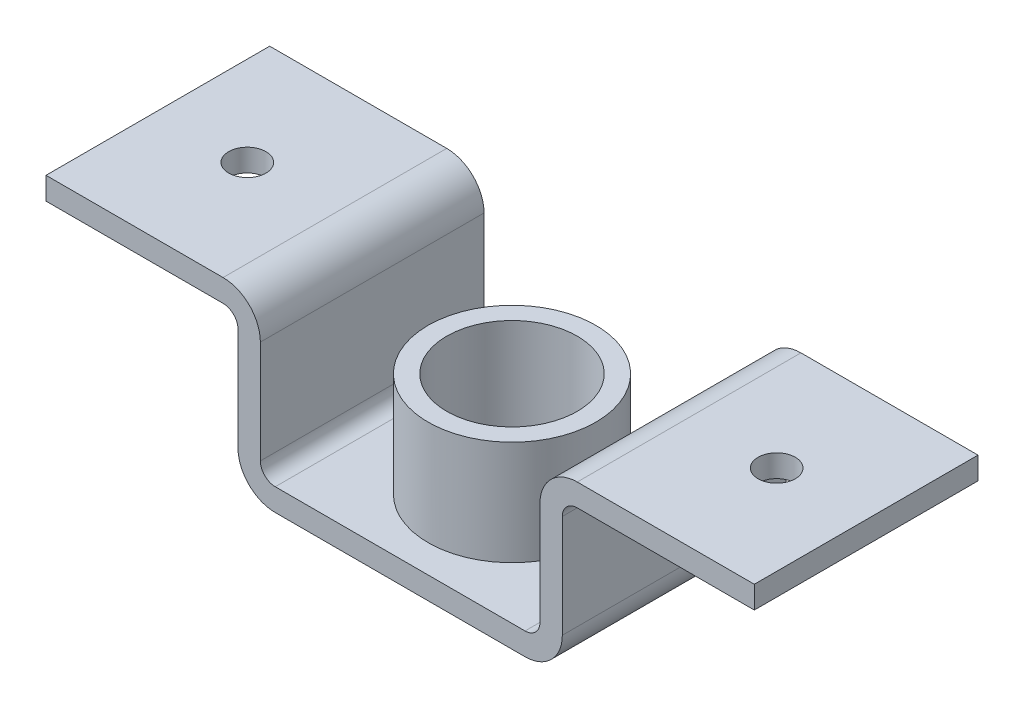
ISO-10303-21;
HEADER;
FILE_DESCRIPTION(('STEP AP214'),'2;1');
FILE_NAME('part.step','',(''),(''),'','','');
FILE_SCHEMA(('AUTOMOTIVE_DESIGN { 1 0 10303 214 1 1 1 1 }'));
ENDSEC;
DATA;
#1=APPLICATION_CONTEXT('core data for automotive mechanical design processes');
#2=APPLICATION_PROTOCOL_DEFINITION('international standard','automotive_design',2000,#1);
#3=PRODUCT_CONTEXT('',#1,'mechanical');
#4=PRODUCT('Part','Part','',(#3));
#5=PRODUCT_RELATED_PRODUCT_CATEGORY('part','',(#4));
#6=PRODUCT_DEFINITION_FORMATION('','',#4);
#7=PRODUCT_DEFINITION_CONTEXT('part definition',#1,'design');
#8=PRODUCT_DEFINITION('design','',#6,#7);
#9=PRODUCT_DEFINITION_SHAPE('','',#8);
#10=(LENGTH_UNIT() NAMED_UNIT(*) SI_UNIT(.MILLI.,.METRE.));
#11=(NAMED_UNIT(*) PLANE_ANGLE_UNIT() SI_UNIT($,.RADIAN.));
#12=(NAMED_UNIT(*) SI_UNIT($,.STERADIAN.) SOLID_ANGLE_UNIT());
#13=UNCERTAINTY_MEASURE_WITH_UNIT(LENGTH_MEASURE(1.E-05),#10,'distance_accuracy_value','');
#14=(GEOMETRIC_REPRESENTATION_CONTEXT(3) GLOBAL_UNCERTAINTY_ASSIGNED_CONTEXT((#13)) GLOBAL_UNIT_ASSIGNED_CONTEXT((#10,
#11,#12)) REPRESENTATION_CONTEXT('',''));
#15=CARTESIAN_POINT('',(0.,0.,0.));
#16=DIRECTION('',(0.,0.,1.));
#17=DIRECTION('',(1.,0.,0.));
#18=AXIS2_PLACEMENT_3D('',#15,#16,#17);
#19=CARTESIAN_POINT('',(-475.,63.6038647342996,150.));
#20=DIRECTION('',(1.,0.,0.));
#21=DIRECTION('',(0.,0.,-1.));
#22=AXIS2_PLACEMENT_3D('',#19,#20,#21);
#23=PLANE('',#22);
#24=DIRECTION('',(0.,-1.,0.));
#25=VECTOR('',#24,1.);
#26=CARTESIAN_POINT('',(-475.,63.6038647342996,-150.));
#27=LINE('',#26,#25);
#28=CARTESIAN_POINT('',(-475.,63.6038647342996,-150.));
#29=VERTEX_POINT('',#28);
#30=CARTESIAN_POINT('',(-475.,33.6038647342996,-150.));
#31=VERTEX_POINT('',#30);
#32=EDGE_CURVE('E192',#29,#31,#27,.T.);
#33=ORIENTED_EDGE('',*,*,#32,.T.);
#34=DIRECTION('',(0.,0.,-1.));
#35=VECTOR('',#34,1.);
#36=CARTESIAN_POINT('',(-475.,33.6038647342996,150.));
#37=LINE('',#36,#35);
#38=CARTESIAN_POINT('',(-475.,33.6038647342996,150.));
#39=VERTEX_POINT('',#38);
#40=EDGE_CURVE('E174',#39,#31,#37,.T.);
#41=ORIENTED_EDGE('',*,*,#40,.F.);
#42=DIRECTION('',(0.,-1.,0.));
#43=VECTOR('',#42,1.);
#44=CARTESIAN_POINT('',(-475.,63.6038647342996,150.));
#45=LINE('',#44,#43);
#46=CARTESIAN_POINT('',(-475.,63.6038647342996,150.));
#47=VERTEX_POINT('',#46);
#48=EDGE_CURVE('E179',#47,#39,#45,.T.);
#49=ORIENTED_EDGE('',*,*,#48,.F.);
#50=DIRECTION('',(0.,0.,-1.));
#51=VECTOR('',#50,1.);
#52=CARTESIAN_POINT('',(-475.,63.6038647342996,150.));
#53=LINE('',#52,#51);
#54=EDGE_CURVE('E294',#47,#29,#53,.T.);
#55=ORIENTED_EDGE('',*,*,#54,.T.);
#56=EDGE_LOOP('',(#33,#41,#49,#55));
#57=FACE_BOUND('',#56,.T.);
#58=ADVANCED_FACE('F37',(#57),#23,.F.);
#59=CARTESIAN_POINT('',(-475.,33.6038647342996,150.));
#60=DIRECTION('',(0.,1.,0.));
#61=DIRECTION('',(0.,0.,1.));
#62=AXIS2_PLACEMENT_3D('',#59,#60,#61);
#63=PLANE('',#62);
#64=CARTESIAN_POINT('',(-355.,33.6038647342996,0.));
#65=DIRECTION('',(0.,1.,0.));
#66=DIRECTION('',(0.,0.,1.));
#67=AXIS2_PLACEMENT_3D('',#64,#65,#66);
#68=CIRCLE('',#67,25.);
#69=CARTESIAN_POINT('',(-355.,33.6038647342996,25.));
#70=VERTEX_POINT('',#69);
#71=EDGE_CURVE('E369',#70,#70,#68,.T.);
#72=ORIENTED_EDGE('',*,*,#71,.T.);
#73=EDGE_LOOP('',(#72));
#74=FACE_BOUND('',#73,.T.);
#75=DIRECTION('',(1.,0.,0.));
#76=VECTOR('',#75,1.);
#77=CARTESIAN_POINT('',(-475.,33.6038647342996,-150.));
#78=LINE('',#77,#76);
#79=CARTESIAN_POINT('',(-237.5,33.6038647342996,-150.));
#80=VERTEX_POINT('',#79);
#81=EDGE_CURVE('E331',#31,#80,#78,.T.);
#82=ORIENTED_EDGE('',*,*,#81,.T.);
#83=DIRECTION('',(0.,0.,-1.));
#84=VECTOR('',#83,1.);
#85=CARTESIAN_POINT('',(-237.5,33.6038647342996,150.));
#86=LINE('',#85,#84);
#87=CARTESIAN_POINT('',(-237.5,33.6038647342996,150.));
#88=VERTEX_POINT('',#87);
#89=EDGE_CURVE('E52',#80,#88,#86,.F.);
#90=ORIENTED_EDGE('',*,*,#89,.T.);
#91=DIRECTION('',(1.,0.,0.));
#92=VECTOR('',#91,1.);
#93=CARTESIAN_POINT('',(-475.,33.6038647342996,150.));
#94=LINE('',#93,#92);
#95=EDGE_CURVE('E170',#39,#88,#94,.T.);
#96=ORIENTED_EDGE('',*,*,#95,.F.);
#97=ORIENTED_EDGE('',*,*,#40,.T.);
#98=EDGE_LOOP('',(#82,#90,#96,#97));
#99=FACE_BOUND('',#98,.T.);
#100=ADVANCED_FACE('F172',(#74,#99),#63,.F.);
#101=CARTESIAN_POINT('',(-217.5,33.6038647342996,150.));
#102=DIRECTION('',(1.,0.,0.));
#103=DIRECTION('',(0.,1.,0.));
#104=AXIS2_PLACEMENT_3D('',#101,#102,#103);
#105=PLANE('',#104);
#106=DIRECTION('',(0.,-1.,0.));
#107=VECTOR('',#106,1.);
#108=CARTESIAN_POINT('',(-217.5,33.6038647342996,150.));
#109=LINE('',#108,#107);
#110=CARTESIAN_POINT('',(-217.5,13.6038647342996,150.));
#111=VERTEX_POINT('',#110);
#112=CARTESIAN_POINT('',(-217.5,-124.3961352657,150.));
#113=VERTEX_POINT('',#112);
#114=EDGE_CURVE('E178',#111,#113,#109,.T.);
#115=ORIENTED_EDGE('',*,*,#114,.F.);
#116=DIRECTION('',(0.,0.,-1.));
#117=VECTOR('',#116,1.);
#118=CARTESIAN_POINT('',(-217.5,13.6038647342996,-150.));
#119=LINE('',#118,#117);
#120=CARTESIAN_POINT('',(-217.5,13.6038647342996,-150.));
#121=VERTEX_POINT('',#120);
#122=EDGE_CURVE('E231',#111,#121,#119,.T.);
#123=ORIENTED_EDGE('',*,*,#122,.T.);
#124=DIRECTION('',(0.,-1.,0.));
#125=VECTOR('',#124,1.);
#126=CARTESIAN_POINT('',(-217.5,33.6038647342996,-150.));
#127=LINE('',#126,#125);
#128=CARTESIAN_POINT('',(-217.5,-124.3961352657,-150.));
#129=VERTEX_POINT('',#128);
#130=EDGE_CURVE('E327',#121,#129,#127,.T.);
#131=ORIENTED_EDGE('',*,*,#130,.T.);
#132=DIRECTION('',(0.,0.,-1.));
#133=VECTOR('',#132,1.);
#134=CARTESIAN_POINT('',(-217.5,-124.3961352657,150.));
#135=LINE('',#134,#133);
#136=EDGE_CURVE('E194',#113,#129,#135,.T.);
#137=ORIENTED_EDGE('',*,*,#136,.F.);
#138=EDGE_LOOP('',(#115,#123,#131,#137));
#139=FACE_BOUND('',#138,.T.);
#140=ADVANCED_FACE('F442',(#139),#105,.F.);
#141=CARTESIAN_POINT('',(-167.5,-124.3961352657,150.));
#142=DIRECTION('',(0.,0.,-1.));
#143=DIRECTION('',(-1.,0.,0.));
#144=AXIS2_PLACEMENT_3D('',#141,#142,#143);
#145=CYLINDRICAL_SURFACE('',#144,50.);
#146=CARTESIAN_POINT('',(-167.5,-124.3961352657,-150.));
#147=DIRECTION('',(0.,0.,1.));
#148=DIRECTION('',(1.,0.,0.));
#149=AXIS2_PLACEMENT_3D('',#146,#147,#148);
#150=CIRCLE('',#149,50.);
#151=CARTESIAN_POINT('',(-167.5,-174.3961352657,-150.));
#152=VERTEX_POINT('',#151);
#153=EDGE_CURVE('E326',#129,#152,#150,.T.);
#154=ORIENTED_EDGE('',*,*,#153,.T.);
#155=DIRECTION('',(0.,0.,-1.));
#156=VECTOR('',#155,1.);
#157=CARTESIAN_POINT('',(-167.5,-174.3961352657,150.));
#158=LINE('',#157,#156);
#159=CARTESIAN_POINT('',(-167.5,-174.3961352657,150.));
#160=VERTEX_POINT('',#159);
#161=EDGE_CURVE('E200',#160,#152,#158,.T.);
#162=ORIENTED_EDGE('',*,*,#161,.F.);
#163=CARTESIAN_POINT('',(-167.5,-124.3961352657,150.));
#164=DIRECTION('',(0.,0.,1.));
#165=DIRECTION('',(1.,0.,0.));
#166=AXIS2_PLACEMENT_3D('',#163,#164,#165);
#167=CIRCLE('',#166,50.);
#168=EDGE_CURVE('E354',#113,#160,#167,.T.);
#169=ORIENTED_EDGE('',*,*,#168,.F.);
#170=ORIENTED_EDGE('',*,*,#136,.T.);
#171=EDGE_LOOP('',(#154,#162,#169,#170));
#172=FACE_BOUND('',#171,.T.);
#173=ADVANCED_FACE('F462',(#172),#145,.T.);
#174=CARTESIAN_POINT('',(-167.5,-174.3961352657,150.));
#175=DIRECTION('',(0.,1.,0.));
#176=DIRECTION('',(-1.,0.,0.));
#177=AXIS2_PLACEMENT_3D('',#174,#175,#176);
#178=PLANE('',#177);
#179=CARTESIAN_POINT('',(0.,-174.3961352657,0.));
#180=DIRECTION('',(0.,1.,0.));
#181=DIRECTION('',(-1.,0.,0.));
#182=AXIS2_PLACEMENT_3D('',#179,#180,#181);
#183=CIRCLE('',#182,37.5);
#184=CARTESIAN_POINT('',(-37.5,-174.3961352657,0.));
#185=VERTEX_POINT('',#184);
#186=EDGE_CURVE('E204',#185,#185,#183,.T.);
#187=ORIENTED_EDGE('',*,*,#186,.T.);
#188=EDGE_LOOP('',(#187));
#189=FACE_BOUND('',#188,.T.);
#190=DIRECTION('',(1.,0.,0.));
#191=VECTOR('',#190,1.);
#192=CARTESIAN_POINT('',(-167.5,-174.3961352657,-150.));
#193=LINE('',#192,#191);
#194=CARTESIAN_POINT('',(167.5,-174.3961352657,-150.));
#195=VERTEX_POINT('',#194);
#196=EDGE_CURVE('E274',#152,#195,#193,.T.);
#197=ORIENTED_EDGE('',*,*,#196,.T.);
#198=DIRECTION('',(0.,0.,-1.));
#199=VECTOR('',#198,1.);
#200=CARTESIAN_POINT('',(167.5,-174.3961352657,150.));
#201=LINE('',#200,#199);
#202=CARTESIAN_POINT('',(167.5,-174.3961352657,150.));
#203=VERTEX_POINT('',#202);
#204=EDGE_CURVE('E313',#203,#195,#201,.T.);
#205=ORIENTED_EDGE('',*,*,#204,.F.);
#206=DIRECTION('',(1.,0.,0.));
#207=VECTOR('',#206,1.);
#208=CARTESIAN_POINT('',(-167.5,-174.3961352657,150.));
#209=LINE('',#208,#207);
#210=EDGE_CURVE('E322',#160,#203,#209,.T.);
#211=ORIENTED_EDGE('',*,*,#210,.F.);
#212=ORIENTED_EDGE('',*,*,#161,.T.);
#213=EDGE_LOOP('',(#197,#205,#211,#212));
#214=FACE_BOUND('',#213,.T.);
#215=ADVANCED_FACE('F320',(#189,#214),#178,.F.);
#216=CARTESIAN_POINT('',(167.5,-124.3961352657,150.));
#217=DIRECTION('',(0.,0.,-1.));
#218=DIRECTION('',(-1.,0.,0.));
#219=AXIS2_PLACEMENT_3D('',#216,#217,#218);
#220=CYLINDRICAL_SURFACE('',#219,50.);
#221=CARTESIAN_POINT('',(167.5,-124.3961352657,-150.));
#222=DIRECTION('',(0.,0.,1.));
#223=DIRECTION('',(1.,0.,0.));
#224=AXIS2_PLACEMENT_3D('',#221,#222,#223);
#225=CIRCLE('',#224,50.);
#226=CARTESIAN_POINT('',(217.5,-124.3961352657,-150.));
#227=VERTEX_POINT('',#226);
#228=EDGE_CURVE('E270',#195,#227,#225,.T.);
#229=ORIENTED_EDGE('',*,*,#228,.T.);
#230=DIRECTION('',(0.,0.,-1.));
#231=VECTOR('',#230,1.);
#232=CARTESIAN_POINT('',(217.5,-124.3961352657,150.));
#233=LINE('',#232,#231);
#234=CARTESIAN_POINT('',(217.5,-124.3961352657,150.));
#235=VERTEX_POINT('',#234);
#236=EDGE_CURVE('E269',#235,#227,#233,.T.);
#237=ORIENTED_EDGE('',*,*,#236,.F.);
#238=CARTESIAN_POINT('',(167.5,-124.3961352657,150.));
#239=DIRECTION('',(0.,0.,1.));
#240=DIRECTION('',(1.,0.,0.));
#241=AXIS2_PLACEMENT_3D('',#238,#239,#240);
#242=CIRCLE('',#241,50.);
#243=EDGE_CURVE('E351',#203,#235,#242,.T.);
#244=ORIENTED_EDGE('',*,*,#243,.F.);
#245=ORIENTED_EDGE('',*,*,#204,.T.);
#246=EDGE_LOOP('',(#229,#237,#244,#245));
#247=FACE_BOUND('',#246,.T.);
#248=ADVANCED_FACE('F465',(#247),#220,.T.);
#249=CARTESIAN_POINT('',(217.5,-124.3961352657,150.));
#250=DIRECTION('',(-1.,0.,0.));
#251=DIRECTION('',(0.,-1.,0.));
#252=AXIS2_PLACEMENT_3D('',#249,#250,#251);
#253=PLANE('',#252);
#254=DIRECTION('',(0.,1.,0.));
#255=VECTOR('',#254,1.);
#256=CARTESIAN_POINT('',(217.5,-124.3961352657,-150.));
#257=LINE('',#256,#255);
#258=CARTESIAN_POINT('',(217.5,13.6038647342995,-150.));
#259=VERTEX_POINT('',#258);
#260=EDGE_CURVE('E262',#227,#259,#257,.T.);
#261=ORIENTED_EDGE('',*,*,#260,.T.);
#262=DIRECTION('',(0.,0.,-1.));
#263=VECTOR('',#262,1.);
#264=CARTESIAN_POINT('',(217.5,13.6038647342995,150.));
#265=LINE('',#264,#263);
#266=CARTESIAN_POINT('',(217.5,13.6038647342995,150.));
#267=VERTEX_POINT('',#266);
#268=EDGE_CURVE('E229',#259,#267,#265,.F.);
#269=ORIENTED_EDGE('',*,*,#268,.T.);
#270=DIRECTION('',(0.,1.,0.));
#271=VECTOR('',#270,1.);
#272=CARTESIAN_POINT('',(217.5,-124.3961352657,150.));
#273=LINE('',#272,#271);
#274=EDGE_CURVE('E244',#235,#267,#273,.T.);
#275=ORIENTED_EDGE('',*,*,#274,.F.);
#276=ORIENTED_EDGE('',*,*,#236,.T.);
#277=EDGE_LOOP('',(#261,#269,#275,#276));
#278=FACE_BOUND('',#277,.T.);
#279=ADVANCED_FACE('F267',(#278),#253,.F.);
#280=CARTESIAN_POINT('',(217.5,33.6038647342995,150.));
#281=DIRECTION('',(0.,1.,0.));
#282=DIRECTION('',(0.,0.,1.));
#283=AXIS2_PLACEMENT_3D('',#280,#281,#282);
#284=PLANE('',#283);
#285=CARTESIAN_POINT('',(355.,33.6038647342995,0.));
#286=DIRECTION('',(0.,1.,0.));
#287=DIRECTION('',(0.,0.,1.));
#288=AXIS2_PLACEMENT_3D('',#285,#286,#287);
#289=CIRCLE('',#288,25.);
#290=CARTESIAN_POINT('',(355.,33.6038647342995,25.));
#291=VERTEX_POINT('',#290);
#292=EDGE_CURVE('E366',#291,#291,#289,.T.);
#293=ORIENTED_EDGE('',*,*,#292,.T.);
#294=EDGE_LOOP('',(#293));
#295=FACE_BOUND('',#294,.T.);
#296=DIRECTION('',(1.,0.,0.));
#297=VECTOR('',#296,1.);
#298=CARTESIAN_POINT('',(217.5,33.6038647342995,150.));
#299=LINE('',#298,#297);
#300=CARTESIAN_POINT('',(237.5,33.6038647342995,150.));
#301=VERTEX_POINT('',#300);
#302=CARTESIAN_POINT('',(475.,33.6038647342995,150.));
#303=VERTEX_POINT('',#302);
#304=EDGE_CURVE('E241',#301,#303,#299,.T.);
#305=ORIENTED_EDGE('',*,*,#304,.F.);
#306=DIRECTION('',(0.,0.,-1.));
#307=VECTOR('',#306,1.);
#308=CARTESIAN_POINT('',(237.5,33.6038647342995,-150.));
#309=LINE('',#308,#307);
#310=CARTESIAN_POINT('',(237.5,33.6038647342995,-150.));
#311=VERTEX_POINT('',#310);
#312=EDGE_CURVE('E226',#301,#311,#309,.T.);
#313=ORIENTED_EDGE('',*,*,#312,.T.);
#314=DIRECTION('',(1.,0.,0.));
#315=VECTOR('',#314,1.);
#316=CARTESIAN_POINT('',(217.5,33.6038647342995,-150.));
#317=LINE('',#316,#315);
#318=CARTESIAN_POINT('',(475.,33.6038647342995,-150.));
#319=VERTEX_POINT('',#318);
#320=EDGE_CURVE('E264',#311,#319,#317,.T.);
#321=ORIENTED_EDGE('',*,*,#320,.T.);
#322=DIRECTION('',(0.,0.,-1.));
#323=VECTOR('',#322,1.);
#324=CARTESIAN_POINT('',(475.,33.6038647342995,150.));
#325=LINE('',#324,#323);
#326=EDGE_CURVE('E252',#303,#319,#325,.T.);
#327=ORIENTED_EDGE('',*,*,#326,.F.);
#328=EDGE_LOOP('',(#305,#313,#321,#327));
#329=FACE_BOUND('',#328,.T.);
#330=ADVANCED_FACE('F249',(#295,#329),#284,.F.);
#331=CARTESIAN_POINT('',(475.,63.6038647342995,150.));
#332=DIRECTION('',(-1.,0.,0.));
#333=DIRECTION('',(0.,0.,1.));
#334=AXIS2_PLACEMENT_3D('',#331,#332,#333);
#335=PLANE('',#334);
#336=DIRECTION('',(0.,1.,0.));
#337=VECTOR('',#336,1.);
#338=CARTESIAN_POINT('',(475.,63.6038647342995,-150.));
#339=LINE('',#338,#337);
#340=CARTESIAN_POINT('',(475.,63.6038647342995,-150.));
#341=VERTEX_POINT('',#340);
#342=EDGE_CURVE('E272',#319,#341,#339,.T.);
#343=ORIENTED_EDGE('',*,*,#342,.T.);
#344=DIRECTION('',(0.,0.,-1.));
#345=VECTOR('',#344,1.);
#346=CARTESIAN_POINT('',(475.,63.6038647342995,150.));
#347=LINE('',#346,#345);
#348=CARTESIAN_POINT('',(475.,63.6038647342995,150.));
#349=VERTEX_POINT('',#348);
#350=EDGE_CURVE('E308',#349,#341,#347,.T.);
#351=ORIENTED_EDGE('',*,*,#350,.F.);
#352=DIRECTION('',(0.,1.,0.));
#353=VECTOR('',#352,1.);
#354=CARTESIAN_POINT('',(475.,63.6038647342995,150.));
#355=LINE('',#354,#353);
#356=EDGE_CURVE('E254',#303,#349,#355,.T.);
#357=ORIENTED_EDGE('',*,*,#356,.F.);
#358=ORIENTED_EDGE('',*,*,#326,.T.);
#359=EDGE_LOOP('',(#343,#351,#357,#358));
#360=FACE_BOUND('',#359,.T.);
#361=ADVANCED_FACE('F426',(#360),#335,.F.);
#362=CARTESIAN_POINT('',(187.5,63.6038647342995,150.));
#363=DIRECTION('',(0.,-1.,0.));
#364=DIRECTION('',(1.,0.,0.));
#365=AXIS2_PLACEMENT_3D('',#362,#363,#364);
#366=PLANE('',#365);
#367=CARTESIAN_POINT('',(355.,63.6038647342994,0.));
#368=DIRECTION('',(0.,1.,0.));
#369=DIRECTION('',(-1.,0.,0.));
#370=AXIS2_PLACEMENT_3D('',#367,#368,#369);
#371=CIRCLE('',#370,25.);
#372=CARTESIAN_POINT('',(330.,63.6038647342994,0.));
#373=VERTEX_POINT('',#372);
#374=EDGE_CURVE('E373',#373,#373,#371,.T.);
#375=ORIENTED_EDGE('',*,*,#374,.F.);
#376=EDGE_LOOP('',(#375));
#377=FACE_BOUND('',#376,.T.);
#378=DIRECTION('',(-1.,0.,0.));
#379=VECTOR('',#378,1.);
#380=CARTESIAN_POINT('',(187.5,63.6038647342995,-150.));
#381=LINE('',#380,#379);
#382=CARTESIAN_POINT('',(237.5,63.6038647342995,-150.));
#383=VERTEX_POINT('',#382);
#384=EDGE_CURVE('E279',#341,#383,#381,.T.);
#385=ORIENTED_EDGE('',*,*,#384,.T.);
#386=DIRECTION('',(0.,0.,-1.));
#387=VECTOR('',#386,1.);
#388=CARTESIAN_POINT('',(237.5,63.6038647342995,150.));
#389=LINE('',#388,#387);
#390=CARTESIAN_POINT('',(237.5,63.6038647342995,150.));
#391=VERTEX_POINT('',#390);
#392=EDGE_CURVE('E215',#383,#391,#389,.F.);
#393=ORIENTED_EDGE('',*,*,#392,.T.);
#394=DIRECTION('',(-1.,0.,0.));
#395=VECTOR('',#394,1.);
#396=CARTESIAN_POINT('',(187.5,63.6038647342995,150.));
#397=LINE('',#396,#395);
#398=EDGE_CURVE('E347',#349,#391,#397,.T.);
#399=ORIENTED_EDGE('',*,*,#398,.F.);
#400=ORIENTED_EDGE('',*,*,#350,.T.);
#401=EDGE_LOOP('',(#385,#393,#399,#400));
#402=FACE_BOUND('',#401,.T.);
#403=ADVANCED_FACE('F420',(#377,#402),#366,.F.);
#404=CARTESIAN_POINT('',(187.5,-124.3961352657,150.));
#405=DIRECTION('',(1.,0.,0.));
#406=DIRECTION('',(0.,1.,0.));
#407=AXIS2_PLACEMENT_3D('',#404,#405,#406);
#408=PLANE('',#407);
#409=DIRECTION('',(0.,-1.,0.));
#410=VECTOR('',#409,1.);
#411=CARTESIAN_POINT('',(187.5,-124.3961352657,150.));
#412=LINE('',#411,#410);
#413=CARTESIAN_POINT('',(187.5,13.6038647342995,150.));
#414=VERTEX_POINT('',#413);
#415=CARTESIAN_POINT('',(187.5,-124.3961352657,150.));
#416=VERTEX_POINT('',#415);
#417=EDGE_CURVE('E345',#414,#416,#412,.T.);
#418=ORIENTED_EDGE('',*,*,#417,.F.);
#419=DIRECTION('',(0.,0.,-1.));
#420=VECTOR('',#419,1.);
#421=CARTESIAN_POINT('',(187.5,13.6038647342995,150.));
#422=LINE('',#421,#420);
#423=CARTESIAN_POINT('',(187.5,13.6038647342995,-150.));
#424=VERTEX_POINT('',#423);
#425=EDGE_CURVE('E197',#414,#424,#422,.T.);
#426=ORIENTED_EDGE('',*,*,#425,.T.);
#427=DIRECTION('',(0.,-1.,0.));
#428=VECTOR('',#427,1.);
#429=CARTESIAN_POINT('',(187.5,-124.3961352657,-150.));
#430=LINE('',#429,#428);
#431=CARTESIAN_POINT('',(187.5,-124.3961352657,-150.));
#432=VERTEX_POINT('',#431);
#433=EDGE_CURVE('E282',#424,#432,#430,.T.);
#434=ORIENTED_EDGE('',*,*,#433,.T.);
#435=DIRECTION('',(0.,0.,-1.));
#436=VECTOR('',#435,1.);
#437=CARTESIAN_POINT('',(187.5,-124.3961352657,150.));
#438=LINE('',#437,#436);
#439=EDGE_CURVE('E305',#416,#432,#438,.T.);
#440=ORIENTED_EDGE('',*,*,#439,.F.);
#441=EDGE_LOOP('',(#418,#426,#434,#440));
#442=FACE_BOUND('',#441,.T.);
#443=ADVANCED_FACE('F414',(#442),#408,.F.);
#444=CARTESIAN_POINT('',(167.5,-124.3961352657,150.));
#445=DIRECTION('',(0.,0.,-1.));
#446=DIRECTION('',(-1.,0.,0.));
#447=AXIS2_PLACEMENT_3D('',#444,#445,#446);
#448=CYLINDRICAL_SURFACE('',#447,20.);
#449=CARTESIAN_POINT('',(167.5,-124.3961352657,-150.));
#450=DIRECTION('',(0.,0.,-1.));
#451=DIRECTION('',(1.,0.,0.));
#452=AXIS2_PLACEMENT_3D('',#449,#450,#451);
#453=CIRCLE('',#452,20.);
#454=CARTESIAN_POINT('',(167.5,-144.3961352657,-150.));
#455=VERTEX_POINT('',#454);
#456=EDGE_CURVE('E284',#432,#455,#453,.T.);
#457=ORIENTED_EDGE('',*,*,#456,.T.);
#458=DIRECTION('',(0.,0.,-1.));
#459=VECTOR('',#458,1.);
#460=CARTESIAN_POINT('',(167.5,-144.3961352657,150.));
#461=LINE('',#460,#459);
#462=CARTESIAN_POINT('',(167.5,-144.3961352657,150.));
#463=VERTEX_POINT('',#462);
#464=EDGE_CURVE('E302',#463,#455,#461,.T.);
#465=ORIENTED_EDGE('',*,*,#464,.F.);
#466=CARTESIAN_POINT('',(167.5,-124.3961352657,150.));
#467=DIRECTION('',(0.,0.,-1.));
#468=DIRECTION('',(1.,0.,0.));
#469=AXIS2_PLACEMENT_3D('',#466,#467,#468);
#470=CIRCLE('',#469,20.);
#471=EDGE_CURVE('E343',#416,#463,#470,.T.);
#472=ORIENTED_EDGE('',*,*,#471,.F.);
#473=ORIENTED_EDGE('',*,*,#439,.T.);
#474=EDGE_LOOP('',(#457,#465,#472,#473));
#475=FACE_BOUND('',#474,.T.);
#476=ADVANCED_FACE('F410',(#475),#448,.F.);
#477=CARTESIAN_POINT('',(-167.5,-144.3961352657,150.));
#478=DIRECTION('',(0.,-1.,0.));
#479=DIRECTION('',(1.,0.,0.));
#480=AXIS2_PLACEMENT_3D('',#477,#478,#479);
#481=PLANE('',#480);
#482=CARTESIAN_POINT('',(0.,-144.3961352657,0.));
#483=DIRECTION('',(0.,-1.,0.));
#484=DIRECTION('',(1.,0.,0.));
#485=AXIS2_PLACEMENT_3D('',#482,#483,#484);
#486=CIRCLE('',#485,112.5);
#487=CARTESIAN_POINT('',(112.5,-144.3961352657,0.));
#488=VERTEX_POINT('',#487);
#489=EDGE_CURVE('E193',#488,#488,#486,.F.);
#490=ORIENTED_EDGE('',*,*,#489,.F.);
#491=EDGE_LOOP('',(#490));
#492=FACE_BOUND('',#491,.T.);
#493=DIRECTION('',(-1.,0.,0.));
#494=VECTOR('',#493,1.);
#495=CARTESIAN_POINT('',(-167.5,-144.3961352657,-150.));
#496=LINE('',#495,#494);
#497=CARTESIAN_POINT('',(-167.5,-144.3961352657,-150.));
#498=VERTEX_POINT('',#497);
#499=EDGE_CURVE('E286',#455,#498,#496,.T.);
#500=ORIENTED_EDGE('',*,*,#499,.T.);
#501=DIRECTION('',(0.,0.,-1.));
#502=VECTOR('',#501,1.);
#503=CARTESIAN_POINT('',(-167.5,-144.3961352657,150.));
#504=LINE('',#503,#502);
#505=CARTESIAN_POINT('',(-167.5,-144.3961352657,150.));
#506=VERTEX_POINT('',#505);
#507=EDGE_CURVE('E299',#506,#498,#504,.T.);
#508=ORIENTED_EDGE('',*,*,#507,.F.);
#509=DIRECTION('',(-1.,0.,0.));
#510=VECTOR('',#509,1.);
#511=CARTESIAN_POINT('',(-167.5,-144.3961352657,150.));
#512=LINE('',#511,#510);
#513=EDGE_CURVE('E341',#463,#506,#512,.T.);
#514=ORIENTED_EDGE('',*,*,#513,.F.);
#515=ORIENTED_EDGE('',*,*,#464,.T.);
#516=EDGE_LOOP('',(#500,#508,#514,#515));
#517=FACE_BOUND('',#516,.T.);
#518=ADVANCED_FACE('F405',(#492,#517),#481,.F.);
#519=CARTESIAN_POINT('',(-167.5,-124.3961352657,150.));
#520=DIRECTION('',(0.,0.,-1.));
#521=DIRECTION('',(-1.,0.,0.));
#522=AXIS2_PLACEMENT_3D('',#519,#520,#521);
#523=CYLINDRICAL_SURFACE('',#522,20.);
#524=CARTESIAN_POINT('',(-167.5,-124.3961352657,-150.));
#525=DIRECTION('',(0.,0.,-1.));
#526=DIRECTION('',(1.,0.,0.));
#527=AXIS2_PLACEMENT_3D('',#524,#525,#526);
#528=CIRCLE('',#527,20.);
#529=CARTESIAN_POINT('',(-187.5,-124.3961352657,-150.));
#530=VERTEX_POINT('',#529);
#531=EDGE_CURVE('E288',#498,#530,#528,.T.);
#532=ORIENTED_EDGE('',*,*,#531,.T.);
#533=DIRECTION('',(0.,0.,-1.));
#534=VECTOR('',#533,1.);
#535=CARTESIAN_POINT('',(-187.5,-124.3961352657,150.));
#536=LINE('',#535,#534);
#537=CARTESIAN_POINT('',(-187.5,-124.3961352657,150.));
#538=VERTEX_POINT('',#537);
#539=EDGE_CURVE('E296',#538,#530,#536,.T.);
#540=ORIENTED_EDGE('',*,*,#539,.F.);
#541=CARTESIAN_POINT('',(-167.5,-124.3961352657,150.));
#542=DIRECTION('',(0.,0.,-1.));
#543=DIRECTION('',(1.,0.,0.));
#544=AXIS2_PLACEMENT_3D('',#541,#542,#543);
#545=CIRCLE('',#544,20.);
#546=EDGE_CURVE('E339',#506,#538,#545,.T.);
#547=ORIENTED_EDGE('',*,*,#546,.F.);
#548=ORIENTED_EDGE('',*,*,#507,.T.);
#549=EDGE_LOOP('',(#532,#540,#547,#548));
#550=FACE_BOUND('',#549,.T.);
#551=ADVANCED_FACE('F400',(#550),#523,.F.);
#552=CARTESIAN_POINT('',(-187.5,63.6038647342995,150.));
#553=DIRECTION('',(-1.,0.,0.));
#554=DIRECTION('',(0.,-1.,0.));
#555=AXIS2_PLACEMENT_3D('',#552,#553,#554);
#556=PLANE('',#555);
#557=DIRECTION('',(0.,1.,0.));
#558=VECTOR('',#557,1.);
#559=CARTESIAN_POINT('',(-187.5,63.6038647342995,-150.));
#560=LINE('',#559,#558);
#561=CARTESIAN_POINT('',(-187.5,13.6038647342995,-150.));
#562=VERTEX_POINT('',#561);
#563=EDGE_CURVE('E290',#530,#562,#560,.T.);
#564=ORIENTED_EDGE('',*,*,#563,.T.);
#565=DIRECTION('',(0.,0.,-1.));
#566=VECTOR('',#565,1.);
#567=CARTESIAN_POINT('',(-187.5,13.6038647342995,150.));
#568=LINE('',#567,#566);
#569=CARTESIAN_POINT('',(-187.5,13.6038647342995,150.));
#570=VERTEX_POINT('',#569);
#571=EDGE_CURVE('E224',#562,#570,#568,.F.);
#572=ORIENTED_EDGE('',*,*,#571,.T.);
#573=DIRECTION('',(0.,1.,0.));
#574=VECTOR('',#573,1.);
#575=CARTESIAN_POINT('',(-187.5,63.6038647342995,150.));
#576=LINE('',#575,#574);
#577=EDGE_CURVE('E336',#538,#570,#576,.T.);
#578=ORIENTED_EDGE('',*,*,#577,.F.);
#579=ORIENTED_EDGE('',*,*,#539,.T.);
#580=EDGE_LOOP('',(#564,#572,#578,#579));
#581=FACE_BOUND('',#580,.T.);
#582=ADVANCED_FACE('F385',(#581),#556,.F.);
#583=CARTESIAN_POINT('',(-475.,63.6038647342996,150.));
#584=DIRECTION('',(0.,-1.,0.));
#585=DIRECTION('',(1.,0.,0.));
#586=AXIS2_PLACEMENT_3D('',#583,#584,#585);
#587=PLANE('',#586);
#588=CARTESIAN_POINT('',(-355.,63.6038647342995,0.));
#589=DIRECTION('',(0.,1.,0.));
#590=DIRECTION('',(-1.,0.,0.));
#591=AXIS2_PLACEMENT_3D('',#588,#589,#590);
#592=CIRCLE('',#591,25.);
#593=CARTESIAN_POINT('',(-380.,63.6038647342995,0.));
#594=VERTEX_POINT('',#593);
#595=EDGE_CURVE('E372',#594,#594,#592,.T.);
#596=ORIENTED_EDGE('',*,*,#595,.F.);
#597=EDGE_LOOP('',(#596));
#598=FACE_BOUND('',#597,.T.);
#599=DIRECTION('',(-1.,0.,0.));
#600=VECTOR('',#599,1.);
#601=CARTESIAN_POINT('',(-475.,63.6038647342996,150.));
#602=LINE('',#601,#600);
#603=CARTESIAN_POINT('',(-237.5,63.6038647342995,150.));
#604=VERTEX_POINT('',#603);
#605=EDGE_CURVE('E185',#604,#47,#602,.T.);
#606=ORIENTED_EDGE('',*,*,#605,.F.);
#607=DIRECTION('',(0.,0.,-1.));
#608=VECTOR('',#607,1.);
#609=CARTESIAN_POINT('',(-237.5,63.6038647342995,150.));
#610=LINE('',#609,#608);
#611=CARTESIAN_POINT('',(-237.5,63.6038647342995,-150.));
#612=VERTEX_POINT('',#611);
#613=EDGE_CURVE('E221',#604,#612,#610,.T.);
#614=ORIENTED_EDGE('',*,*,#613,.T.);
#615=DIRECTION('',(-1.,0.,0.));
#616=VECTOR('',#615,1.);
#617=CARTESIAN_POINT('',(-475.,63.6038647342996,-150.));
#618=LINE('',#617,#616);
#619=EDGE_CURVE('E189',#612,#29,#618,.T.);
#620=ORIENTED_EDGE('',*,*,#619,.T.);
#621=ORIENTED_EDGE('',*,*,#54,.F.);
#622=EDGE_LOOP('',(#606,#614,#620,#621));
#623=FACE_BOUND('',#622,.T.);
#624=ADVANCED_FACE('F382',(#598,#623),#587,.F.);
#625=CARTESIAN_POINT('',(-167.5,-124.3961352657,150.));
#626=DIRECTION('',(0.,0.,1.));
#627=DIRECTION('',(1.,0.,0.));
#628=AXIS2_PLACEMENT_3D('',#625,#626,#627);
#629=PLANE('',#628);
#630=ORIENTED_EDGE('',*,*,#398,.T.);
#631=CARTESIAN_POINT('',(237.5,13.6038647342995,150.));
#632=DIRECTION('',(0.,0.,1.));
#633=DIRECTION('',(1.,0.,0.));
#634=AXIS2_PLACEMENT_3D('',#631,#632,#633);
#635=CIRCLE('',#634,50.);
#636=EDGE_CURVE('E219',#391,#414,#635,.T.);
#637=ORIENTED_EDGE('',*,*,#636,.T.);
#638=ORIENTED_EDGE('',*,*,#417,.T.);
#639=ORIENTED_EDGE('',*,*,#471,.T.);
#640=ORIENTED_EDGE('',*,*,#513,.T.);
#641=ORIENTED_EDGE('',*,*,#546,.T.);
#642=ORIENTED_EDGE('',*,*,#577,.T.);
#643=CARTESIAN_POINT('',(-237.5,13.6038647342995,150.));
#644=DIRECTION('',(0.,0.,1.));
#645=DIRECTION('',(1.,0.,0.));
#646=AXIS2_PLACEMENT_3D('',#643,#644,#645);
#647=CIRCLE('',#646,50.);
#648=EDGE_CURVE('E217',#570,#604,#647,.T.);
#649=ORIENTED_EDGE('',*,*,#648,.T.);
#650=ORIENTED_EDGE('',*,*,#605,.T.);
#651=ORIENTED_EDGE('',*,*,#48,.T.);
#652=ORIENTED_EDGE('',*,*,#95,.T.);
#653=CARTESIAN_POINT('',(-237.5,13.6038647342996,150.));
#654=DIRECTION('',(0.,0.,1.));
#655=DIRECTION('',(1.,0.,0.));
#656=AXIS2_PLACEMENT_3D('',#653,#654,#655);
#657=CIRCLE('',#656,20.);
#658=EDGE_CURVE('E11',#88,#111,#657,.F.);
#659=ORIENTED_EDGE('',*,*,#658,.T.);
#660=ORIENTED_EDGE('',*,*,#114,.T.);
#661=ORIENTED_EDGE('',*,*,#168,.T.);
#662=ORIENTED_EDGE('',*,*,#210,.T.);
#663=ORIENTED_EDGE('',*,*,#243,.T.);
#664=ORIENTED_EDGE('',*,*,#274,.T.);
#665=CARTESIAN_POINT('',(237.5,13.6038647342995,150.));
#666=DIRECTION('',(0.,0.,1.));
#667=DIRECTION('',(1.,0.,0.));
#668=AXIS2_PLACEMENT_3D('',#665,#666,#667);
#669=CIRCLE('',#668,20.);
#670=EDGE_CURVE('E237',#267,#301,#669,.F.);
#671=ORIENTED_EDGE('',*,*,#670,.T.);
#672=ORIENTED_EDGE('',*,*,#304,.T.);
#673=ORIENTED_EDGE('',*,*,#356,.T.);
#674=EDGE_LOOP('',(#630,#637,#638,#639,#640,#641,#642,#649,#650,#651,#652,#659,#660,#661,#662,
#663,#664,#671,#672,#673));
#675=FACE_BOUND('',#674,.T.);
#676=ADVANCED_FACE('F183',(#675),#629,.T.);
#677=CARTESIAN_POINT('',(-167.5,-124.3961352657,-150.));
#678=DIRECTION('',(0.,0.,1.));
#679=DIRECTION('',(1.,0.,0.));
#680=AXIS2_PLACEMENT_3D('',#677,#678,#679);
#681=PLANE('',#680);
#682=ORIENTED_EDGE('',*,*,#433,.F.);
#683=CARTESIAN_POINT('',(237.5,13.6038647342995,-150.));
#684=DIRECTION('',(0.,0.,1.));
#685=DIRECTION('',(1.,0.,0.));
#686=AXIS2_PLACEMENT_3D('',#683,#684,#685);
#687=CIRCLE('',#686,50.);
#688=EDGE_CURVE('E213',#424,#383,#687,.F.);
#689=ORIENTED_EDGE('',*,*,#688,.T.);
#690=ORIENTED_EDGE('',*,*,#384,.F.);
#691=ORIENTED_EDGE('',*,*,#342,.F.);
#692=ORIENTED_EDGE('',*,*,#320,.F.);
#693=CARTESIAN_POINT('',(237.5,13.6038647342995,-150.));
#694=DIRECTION('',(0.,0.,1.));
#695=DIRECTION('',(1.,0.,0.));
#696=AXIS2_PLACEMENT_3D('',#693,#694,#695);
#697=CIRCLE('',#696,20.);
#698=EDGE_CURVE('E235',#311,#259,#697,.T.);
#699=ORIENTED_EDGE('',*,*,#698,.T.);
#700=ORIENTED_EDGE('',*,*,#260,.F.);
#701=ORIENTED_EDGE('',*,*,#228,.F.);
#702=ORIENTED_EDGE('',*,*,#196,.F.);
#703=ORIENTED_EDGE('',*,*,#153,.F.);
#704=ORIENTED_EDGE('',*,*,#130,.F.);
#705=CARTESIAN_POINT('',(-237.5,13.6038647342996,-150.));
#706=DIRECTION('',(0.,0.,1.));
#707=DIRECTION('',(1.,0.,0.));
#708=AXIS2_PLACEMENT_3D('',#705,#706,#707);
#709=CIRCLE('',#708,20.);
#710=EDGE_CURVE('E45',#121,#80,#709,.T.);
#711=ORIENTED_EDGE('',*,*,#710,.T.);
#712=ORIENTED_EDGE('',*,*,#81,.F.);
#713=ORIENTED_EDGE('',*,*,#32,.F.);
#714=ORIENTED_EDGE('',*,*,#619,.F.);
#715=CARTESIAN_POINT('',(-237.5,13.6038647342995,-150.));
#716=DIRECTION('',(0.,0.,1.));
#717=DIRECTION('',(1.,0.,0.));
#718=AXIS2_PLACEMENT_3D('',#715,#716,#717);
#719=CIRCLE('',#718,50.);
#720=EDGE_CURVE('E211',#612,#562,#719,.F.);
#721=ORIENTED_EDGE('',*,*,#720,.T.);
#722=ORIENTED_EDGE('',*,*,#563,.F.);
#723=ORIENTED_EDGE('',*,*,#531,.F.);
#724=ORIENTED_EDGE('',*,*,#499,.F.);
#725=ORIENTED_EDGE('',*,*,#456,.F.);
#726=EDGE_LOOP('',(#682,#689,#690,#691,#692,#699,#700,#701,#702,#703,#704,#711,#712,#713,#714,
#721,#722,#723,#724,#725));
#727=FACE_BOUND('',#726,.T.);
#728=ADVANCED_FACE('F260',(#727),#681,.F.);
#729=CARTESIAN_POINT('',(0.,-4.39613526570037,0.));
#730=DIRECTION('',(0.,1.,0.));
#731=DIRECTION('',(-1.,0.,0.));
#732=AXIS2_PLACEMENT_3D('',#729,#730,#731);
#733=PLANE('',#732);
#734=CARTESIAN_POINT('',(0.,-4.39613526570037,0.));
#735=DIRECTION('',(0.,1.,0.));
#736=DIRECTION('',(-1.,0.,0.));
#737=AXIS2_PLACEMENT_3D('',#734,#735,#736);
#738=CIRCLE('',#737,112.5);
#739=CARTESIAN_POINT('',(-112.5,-4.39613526570038,0.));
#740=VERTEX_POINT('',#739);
#741=EDGE_CURVE('E334',#740,#740,#738,.T.);
#742=ORIENTED_EDGE('',*,*,#741,.T.);
#743=EDGE_LOOP('',(#742));
#744=FACE_BOUND('',#743,.T.);
#745=CARTESIAN_POINT('',(0.,-4.39613526570037,0.));
#746=DIRECTION('',(0.,1.,0.));
#747=DIRECTION('',(-1.,0.,0.));
#748=AXIS2_PLACEMENT_3D('',#745,#746,#747);
#749=CIRCLE('',#748,87.5);
#750=CARTESIAN_POINT('',(-87.5,-4.39613526570038,0.));
#751=VERTEX_POINT('',#750);
#752=EDGE_CURVE('E359',#751,#751,#749,.T.);
#753=ORIENTED_EDGE('',*,*,#752,.F.);
#754=EDGE_LOOP('',(#753));
#755=FACE_BOUND('',#754,.T.);
#756=ADVANCED_FACE('F670',(#744,#755),#733,.T.);
#757=CARTESIAN_POINT('',(0.,-4.39613526570037,0.));
#758=DIRECTION('',(0.,-1.,0.));
#759=DIRECTION('',(1.,0.,0.));
#760=AXIS2_PLACEMENT_3D('',#757,#758,#759);
#761=CYLINDRICAL_SURFACE('',#760,112.5);
#762=ORIENTED_EDGE('',*,*,#741,.F.);
#763=EDGE_LOOP('',(#762));
#764=FACE_BOUND('',#763,.T.);
#765=ORIENTED_EDGE('',*,*,#489,.T.);
#766=EDGE_LOOP('',(#765));
#767=FACE_BOUND('',#766,.T.);
#768=ADVANCED_FACE('F684',(#764,#767),#761,.T.);
#769=CARTESIAN_POINT('',(0.,-4.39613526570037,0.));
#770=DIRECTION('',(0.,-1.,0.));
#771=DIRECTION('',(1.,0.,0.));
#772=AXIS2_PLACEMENT_3D('',#769,#770,#771);
#773=CYLINDRICAL_SURFACE('',#772,87.5);
#774=ORIENTED_EDGE('',*,*,#752,.T.);
#775=EDGE_LOOP('',(#774));
#776=FACE_BOUND('',#775,.T.);
#777=CARTESIAN_POINT('',(0.,-144.3961352657,0.));
#778=DIRECTION('',(0.,1.,0.));
#779=DIRECTION('',(-1.,0.,0.));
#780=AXIS2_PLACEMENT_3D('',#777,#778,#779);
#781=CIRCLE('',#780,87.5);
#782=CARTESIAN_POINT('',(-87.5,-144.3961352657,0.));
#783=VERTEX_POINT('',#782);
#784=EDGE_CURVE('E207',#783,#783,#781,.T.);
#785=ORIENTED_EDGE('',*,*,#784,.F.);
#786=EDGE_LOOP('',(#785));
#787=FACE_BOUND('',#786,.T.);
#788=ADVANCED_FACE('F499',(#776,#787),#773,.F.);
#789=CARTESIAN_POINT('',(0.,-144.3961352657,0.));
#790=DIRECTION('',(0.,1.,0.));
#791=DIRECTION('',(-1.,0.,0.));
#792=AXIS2_PLACEMENT_3D('',#789,#790,#791);
#793=CIRCLE('',#792,37.5);
#794=CARTESIAN_POINT('',(-37.5,-144.3961352657,0.));
#795=VERTEX_POINT('',#794);
#796=EDGE_CURVE('E208',#795,#795,#793,.T.);
#797=ORIENTED_EDGE('',*,*,#796,.F.);
#798=EDGE_LOOP('',(#797));
#799=FACE_BOUND('',#798,.T.);
#800=ORIENTED_EDGE('',*,*,#784,.T.);
#801=EDGE_LOOP('',(#800));
#802=FACE_BOUND('',#801,.T.);
#803=ADVANCED_FACE('F504',(#799,#802),#481,.F.);
#804=CARTESIAN_POINT('',(0.,-283.3961352657,0.));
#805=DIRECTION('',(0.,1.,0.));
#806=DIRECTION('',(-1.,0.,0.));
#807=AXIS2_PLACEMENT_3D('',#804,#805,#806);
#808=CYLINDRICAL_SURFACE('',#807,37.5);
#809=ORIENTED_EDGE('',*,*,#796,.T.);
#810=EDGE_LOOP('',(#809));
#811=FACE_BOUND('',#810,.T.);
#812=ORIENTED_EDGE('',*,*,#186,.F.);
#813=EDGE_LOOP('',(#812));
#814=FACE_BOUND('',#813,.T.);
#815=ADVANCED_FACE('F509',(#811,#814),#808,.F.);
#816=CARTESIAN_POINT('',(-355.,-75.3961352657005,0.));
#817=DIRECTION('',(0.,1.,0.));
#818=DIRECTION('',(-1.,0.,0.));
#819=AXIS2_PLACEMENT_3D('',#816,#817,#818);
#820=CYLINDRICAL_SURFACE('',#819,25.);
#821=ORIENTED_EDGE('',*,*,#595,.T.);
#822=EDGE_LOOP('',(#821));
#823=FACE_BOUND('',#822,.T.);
#824=ORIENTED_EDGE('',*,*,#71,.F.);
#825=EDGE_LOOP('',(#824));
#826=FACE_BOUND('',#825,.T.);
#827=ADVANCED_FACE('F379',(#823,#826),#820,.F.);
#828=CARTESIAN_POINT('',(355.,-75.3961352657006,0.));
#829=DIRECTION('',(0.,1.,0.));
#830=DIRECTION('',(-1.,0.,0.));
#831=AXIS2_PLACEMENT_3D('',#828,#829,#830);
#832=CYLINDRICAL_SURFACE('',#831,25.);
#833=ORIENTED_EDGE('',*,*,#374,.T.);
#834=EDGE_LOOP('',(#833));
#835=FACE_BOUND('',#834,.T.);
#836=ORIENTED_EDGE('',*,*,#292,.F.);
#837=EDGE_LOOP('',(#836));
#838=FACE_BOUND('',#837,.T.);
#839=ADVANCED_FACE('F449',(#835,#838),#832,.F.);
#840=CARTESIAN_POINT('',(237.5,13.6038647342995,150.));
#841=DIRECTION('',(0.,0.,-1.));
#842=DIRECTION('',(-1.,0.,0.));
#843=AXIS2_PLACEMENT_3D('',#840,#841,#842);
#844=CYLINDRICAL_SURFACE('',#843,50.);
#845=ORIENTED_EDGE('',*,*,#636,.F.);
#846=ORIENTED_EDGE('',*,*,#392,.F.);
#847=ORIENTED_EDGE('',*,*,#688,.F.);
#848=ORIENTED_EDGE('',*,*,#425,.F.);
#849=EDGE_LOOP('',(#845,#846,#847,#848));
#850=FACE_BOUND('',#849,.T.);
#851=ADVANCED_FACE('F424',(#850),#844,.T.);
#852=CARTESIAN_POINT('',(-237.5,13.6038647342995,150.));
#853=DIRECTION('',(0.,0.,-1.));
#854=DIRECTION('',(-1.,0.,0.));
#855=AXIS2_PLACEMENT_3D('',#852,#853,#854);
#856=CYLINDRICAL_SURFACE('',#855,50.);
#857=ORIENTED_EDGE('',*,*,#648,.F.);
#858=ORIENTED_EDGE('',*,*,#571,.F.);
#859=ORIENTED_EDGE('',*,*,#720,.F.);
#860=ORIENTED_EDGE('',*,*,#613,.F.);
#861=EDGE_LOOP('',(#857,#858,#859,#860));
#862=FACE_BOUND('',#861,.T.);
#863=ADVANCED_FACE('F391',(#862),#856,.T.);
#864=CARTESIAN_POINT('',(237.5,13.6038647342995,150.));
#865=DIRECTION('',(0.,0.,1.));
#866=DIRECTION('',(1.,0.,0.));
#867=AXIS2_PLACEMENT_3D('',#864,#865,#866);
#868=CYLINDRICAL_SURFACE('',#867,20.);
#869=ORIENTED_EDGE('',*,*,#670,.F.);
#870=ORIENTED_EDGE('',*,*,#268,.F.);
#871=ORIENTED_EDGE('',*,*,#698,.F.);
#872=ORIENTED_EDGE('',*,*,#312,.F.);
#873=EDGE_LOOP('',(#869,#870,#871,#872));
#874=FACE_BOUND('',#873,.T.);
#875=ADVANCED_FACE('F256',(#874),#868,.F.);
#876=CARTESIAN_POINT('',(-237.5,13.6038647342996,150.));
#877=DIRECTION('',(0.,0.,1.));
#878=DIRECTION('',(1.,0.,0.));
#879=AXIS2_PLACEMENT_3D('',#876,#877,#878);
#880=CYLINDRICAL_SURFACE('',#879,20.);
#881=ORIENTED_EDGE('',*,*,#658,.F.);
#882=ORIENTED_EDGE('',*,*,#89,.F.);
#883=ORIENTED_EDGE('',*,*,#710,.F.);
#884=ORIENTED_EDGE('',*,*,#122,.F.);
#885=EDGE_LOOP('',(#881,#882,#883,#884));
#886=FACE_BOUND('',#885,.T.);
#887=ADVANCED_FACE('F39',(#886),#880,.F.);
#888=CLOSED_SHELL('',(#58,#100,#140,#173,#215,#248,#279,#330,#361,#403,#443,#476,#518,#551,#582,
#624,#676,#728,#756,#768,#788,#803,#815,#827,#839,#851,#863,#875,#887));
#889=MANIFOLD_SOLID_BREP('B2',#888);
#890=ADVANCED_BREP_SHAPE_REPRESENTATION('',(#18,#889),#14);
#891=SHAPE_DEFINITION_REPRESENTATION(#9,#890);
ENDSEC;
END-ISO-10303-21;
